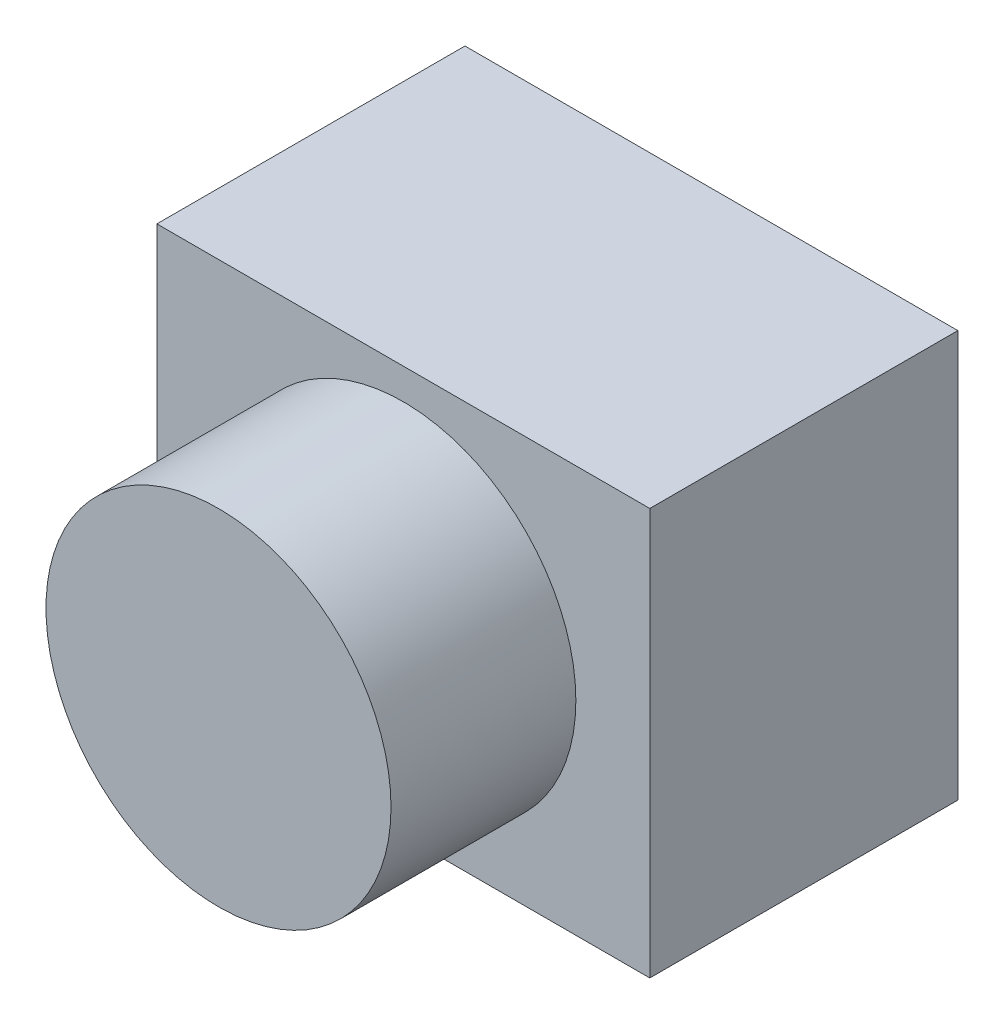
ISO-10303-21;
HEADER;
FILE_DESCRIPTION(('STEP AP214'),'2;1');
FILE_NAME('part.step','',(''),(''),'','','');
FILE_SCHEMA(('AUTOMOTIVE_DESIGN { 1 0 10303 214 1 1 1 1 }'));
ENDSEC;
DATA;
#1=APPLICATION_CONTEXT('core data for automotive mechanical design processes');
#2=APPLICATION_PROTOCOL_DEFINITION('international standard','automotive_design',2000,#1);
#3=PRODUCT_CONTEXT('',#1,'mechanical');
#4=PRODUCT('Part','Part','',(#3));
#5=PRODUCT_RELATED_PRODUCT_CATEGORY('part','',(#4));
#6=PRODUCT_DEFINITION_FORMATION('','',#4);
#7=PRODUCT_DEFINITION_CONTEXT('part definition',#1,'design');
#8=PRODUCT_DEFINITION('design','',#6,#7);
#9=PRODUCT_DEFINITION_SHAPE('','',#8);
#10=(LENGTH_UNIT() NAMED_UNIT(*) SI_UNIT(.MILLI.,.METRE.));
#11=(NAMED_UNIT(*) PLANE_ANGLE_UNIT() SI_UNIT($,.RADIAN.));
#12=(NAMED_UNIT(*) SI_UNIT($,.STERADIAN.) SOLID_ANGLE_UNIT());
#13=UNCERTAINTY_MEASURE_WITH_UNIT(LENGTH_MEASURE(1.E-05),#10,'distance_accuracy_value','');
#14=(GEOMETRIC_REPRESENTATION_CONTEXT(3) GLOBAL_UNCERTAINTY_ASSIGNED_CONTEXT((#13)) GLOBAL_UNIT_ASSIGNED_CONTEXT((#10,
#11,#12)) REPRESENTATION_CONTEXT('',''));
#15=CARTESIAN_POINT('',(0.,0.,0.));
#16=DIRECTION('',(0.,0.,1.));
#17=DIRECTION('',(1.,0.,0.));
#18=AXIS2_PLACEMENT_3D('',#15,#16,#17);
#19=CARTESIAN_POINT('',(-33.0434782608696,32.9347826086957,50.));
#20=DIRECTION('',(1.,0.,0.));
#21=DIRECTION('',(0.,1.,0.));
#22=AXIS2_PLACEMENT_3D('',#19,#20,#21);
#23=PLANE('',#22);
#24=DIRECTION('',(0.,-1.,0.));
#25=VECTOR('',#24,1.);
#26=CARTESIAN_POINT('',(-33.0434782608696,32.9347826086957,0.));
#27=LINE('',#26,#25);
#28=CARTESIAN_POINT('',(-33.0434782608696,32.9347826086957,0.));
#29=VERTEX_POINT('',#28);
#30=CARTESIAN_POINT('',(-33.0434782608696,-33.0652173913043,0.));
#31=VERTEX_POINT('',#30);
#32=EDGE_CURVE('E114',#29,#31,#27,.T.);
#33=ORIENTED_EDGE('',*,*,#32,.T.);
#34=DIRECTION('',(0.,0.,-1.));
#35=VECTOR('',#34,1.);
#36=CARTESIAN_POINT('',(-33.0434782608696,-33.0652173913043,50.));
#37=LINE('',#36,#35);
#38=CARTESIAN_POINT('',(-33.0434782608696,-33.0652173913043,50.));
#39=VERTEX_POINT('',#38);
#40=EDGE_CURVE('E46',#39,#31,#37,.T.);
#41=ORIENTED_EDGE('',*,*,#40,.F.);
#42=DIRECTION('',(0.,-1.,0.));
#43=VECTOR('',#42,1.);
#44=CARTESIAN_POINT('',(-33.0434782608696,32.9347826086957,50.));
#45=LINE('',#44,#43);
#46=CARTESIAN_POINT('',(-33.0434782608696,32.9347826086957,50.));
#47=VERTEX_POINT('',#46);
#48=EDGE_CURVE('E97',#47,#39,#45,.T.);
#49=ORIENTED_EDGE('',*,*,#48,.F.);
#50=DIRECTION('',(0.,0.,-1.));
#51=VECTOR('',#50,1.);
#52=CARTESIAN_POINT('',(-33.0434782608696,32.9347826086957,50.));
#53=LINE('',#52,#51);
#54=EDGE_CURVE('E110',#47,#29,#53,.T.);
#55=ORIENTED_EDGE('',*,*,#54,.T.);
#56=EDGE_LOOP('',(#33,#41,#49,#55));
#57=FACE_BOUND('',#56,.T.);
#58=ADVANCED_FACE('F43',(#57),#23,.F.);
#59=CARTESIAN_POINT('',(-33.0434782608696,-33.0652173913043,50.));
#60=DIRECTION('',(0.,1.,0.));
#61=DIRECTION('',(0.,0.,1.));
#62=AXIS2_PLACEMENT_3D('',#59,#60,#61);
#63=PLANE('',#62);
#64=DIRECTION('',(1.,0.,0.));
#65=VECTOR('',#64,1.);
#66=CARTESIAN_POINT('',(-33.0434782608696,-33.0652173913043,0.));
#67=LINE('',#66,#65);
#68=CARTESIAN_POINT('',(46.9565217391304,-33.0652173913043,0.));
#69=VERTEX_POINT('',#68);
#70=EDGE_CURVE('E103',#31,#69,#67,.T.);
#71=ORIENTED_EDGE('',*,*,#70,.T.);
#72=DIRECTION('',(0.,0.,-1.));
#73=VECTOR('',#72,1.);
#74=CARTESIAN_POINT('',(46.9565217391304,-33.0652173913043,50.));
#75=LINE('',#74,#73);
#76=CARTESIAN_POINT('',(46.9565217391304,-33.0652173913043,50.));
#77=VERTEX_POINT('',#76);
#78=EDGE_CURVE('E101',#77,#69,#75,.T.);
#79=ORIENTED_EDGE('',*,*,#78,.F.);
#80=DIRECTION('',(1.,0.,0.));
#81=VECTOR('',#80,1.);
#82=CARTESIAN_POINT('',(-33.0434782608696,-33.0652173913043,50.));
#83=LINE('',#82,#81);
#84=EDGE_CURVE('E92',#39,#77,#83,.T.);
#85=ORIENTED_EDGE('',*,*,#84,.F.);
#86=ORIENTED_EDGE('',*,*,#40,.T.);
#87=EDGE_LOOP('',(#71,#79,#85,#86));
#88=FACE_BOUND('',#87,.T.);
#89=ADVANCED_FACE('F102',(#88),#63,.F.);
#90=CARTESIAN_POINT('',(46.9565217391304,32.9347826086957,50.));
#91=DIRECTION('',(-1.,0.,0.));
#92=DIRECTION('',(0.,0.,1.));
#93=AXIS2_PLACEMENT_3D('',#90,#91,#92);
#94=PLANE('',#93);
#95=DIRECTION('',(0.,1.,0.));
#96=VECTOR('',#95,1.);
#97=CARTESIAN_POINT('',(46.9565217391304,32.9347826086957,0.));
#98=LINE('',#97,#96);
#99=CARTESIAN_POINT('',(46.9565217391304,32.9347826086957,0.));
#100=VERTEX_POINT('',#99);
#101=EDGE_CURVE('E78',#69,#100,#98,.T.);
#102=ORIENTED_EDGE('',*,*,#101,.T.);
#103=DIRECTION('',(0.,0.,-1.));
#104=VECTOR('',#103,1.);
#105=CARTESIAN_POINT('',(46.9565217391304,32.9347826086957,50.));
#106=LINE('',#105,#104);
#107=CARTESIAN_POINT('',(46.9565217391304,32.9347826086957,50.));
#108=VERTEX_POINT('',#107);
#109=EDGE_CURVE('E105',#108,#100,#106,.T.);
#110=ORIENTED_EDGE('',*,*,#109,.F.);
#111=DIRECTION('',(0.,1.,0.));
#112=VECTOR('',#111,1.);
#113=CARTESIAN_POINT('',(46.9565217391304,32.9347826086957,50.));
#114=LINE('',#113,#112);
#115=EDGE_CURVE('E95',#77,#108,#114,.T.);
#116=ORIENTED_EDGE('',*,*,#115,.F.);
#117=ORIENTED_EDGE('',*,*,#78,.T.);
#118=EDGE_LOOP('',(#102,#110,#116,#117));
#119=FACE_BOUND('',#118,.T.);
#120=ADVANCED_FACE('F106',(#119),#94,.F.);
#121=CARTESIAN_POINT('',(-33.0434782608696,32.9347826086957,50.));
#122=DIRECTION('',(0.,-1.,0.));
#123=DIRECTION('',(0.,0.,-1.));
#124=AXIS2_PLACEMENT_3D('',#121,#122,#123);
#125=PLANE('',#124);
#126=DIRECTION('',(-1.,0.,0.));
#127=VECTOR('',#126,1.);
#128=CARTESIAN_POINT('',(-33.0434782608696,32.9347826086957,0.));
#129=LINE('',#128,#127);
#130=EDGE_CURVE('E84',#100,#29,#129,.T.);
#131=ORIENTED_EDGE('',*,*,#130,.T.);
#132=ORIENTED_EDGE('',*,*,#54,.F.);
#133=DIRECTION('',(-1.,0.,0.));
#134=VECTOR('',#133,1.);
#135=CARTESIAN_POINT('',(-33.0434782608696,32.9347826086957,50.));
#136=LINE('',#135,#134);
#137=EDGE_CURVE('E61',#108,#47,#136,.T.);
#138=ORIENTED_EDGE('',*,*,#137,.F.);
#139=ORIENTED_EDGE('',*,*,#109,.T.);
#140=EDGE_LOOP('',(#131,#132,#138,#139));
#141=FACE_BOUND('',#140,.T.);
#142=ADVANCED_FACE('F128',(#141),#125,.F.);
#143=CARTESIAN_POINT('',(0.,0.,50.));
#144=DIRECTION('',(0.,0.,1.));
#145=DIRECTION('',(1.,0.,0.));
#146=AXIS2_PLACEMENT_3D('',#143,#144,#145);
#147=PLANE('',#146);
#148=CARTESIAN_POINT('',(6.95652173913043,-0.0652173913043425,50.));
#149=DIRECTION('',(0.,0.,1.));
#150=DIRECTION('',(1.,0.,0.));
#151=AXIS2_PLACEMENT_3D('',#148,#149,#150);
#152=CIRCLE('',#151,28.);
#153=CARTESIAN_POINT('',(34.9565217391304,-0.0652173913043425,50.));
#154=VERTEX_POINT('',#153);
#155=EDGE_CURVE('E11',#154,#154,#152,.T.);
#156=ORIENTED_EDGE('',*,*,#155,.F.);
#157=EDGE_LOOP('',(#156));
#158=FACE_BOUND('',#157,.T.);
#159=ORIENTED_EDGE('',*,*,#48,.T.);
#160=ORIENTED_EDGE('',*,*,#84,.T.);
#161=ORIENTED_EDGE('',*,*,#115,.T.);
#162=ORIENTED_EDGE('',*,*,#137,.T.);
#163=EDGE_LOOP('',(#159,#160,#161,#162));
#164=FACE_BOUND('',#163,.T.);
#165=ADVANCED_FACE('F93',(#158,#164),#147,.T.);
#166=CARTESIAN_POINT('',(0.,0.,0.));
#167=DIRECTION('',(0.,0.,1.));
#168=DIRECTION('',(1.,0.,0.));
#169=AXIS2_PLACEMENT_3D('',#166,#167,#168);
#170=PLANE('',#169);
#171=ORIENTED_EDGE('',*,*,#32,.F.);
#172=ORIENTED_EDGE('',*,*,#130,.F.);
#173=ORIENTED_EDGE('',*,*,#101,.F.);
#174=ORIENTED_EDGE('',*,*,#70,.F.);
#175=EDGE_LOOP('',(#171,#172,#173,#174));
#176=FACE_BOUND('',#175,.T.);
#177=ADVANCED_FACE('F131',(#176),#170,.F.);
#178=CARTESIAN_POINT('',(6.95652173913043,-0.0652173913043425,80.));
#179=DIRECTION('',(0.,0.,-1.));
#180=DIRECTION('',(-1.,0.,0.));
#181=AXIS2_PLACEMENT_3D('',#178,#179,#180);
#182=CYLINDRICAL_SURFACE('',#181,28.);
#183=CARTESIAN_POINT('',(6.95652173913043,-0.0652173913043425,80.));
#184=DIRECTION('',(0.,0.,1.));
#185=DIRECTION('',(1.,0.,0.));
#186=AXIS2_PLACEMENT_3D('',#183,#184,#185);
#187=CIRCLE('',#186,28.);
#188=CARTESIAN_POINT('',(34.9565217391304,-0.0652173913043425,80.));
#189=VERTEX_POINT('',#188);
#190=EDGE_CURVE('E118',#189,#189,#187,.T.);
#191=ORIENTED_EDGE('',*,*,#190,.F.);
#192=EDGE_LOOP('',(#191));
#193=FACE_BOUND('',#192,.T.);
#194=ORIENTED_EDGE('',*,*,#155,.T.);
#195=EDGE_LOOP('',(#194));
#196=FACE_BOUND('',#195,.T.);
#197=ADVANCED_FACE('F141',(#193,#196),#182,.T.);
#198=CARTESIAN_POINT('',(6.95652173913043,-0.0652173913043425,80.));
#199=DIRECTION('',(0.,0.,1.));
#200=DIRECTION('',(1.,0.,0.));
#201=AXIS2_PLACEMENT_3D('',#198,#199,#200);
#202=PLANE('',#201);
#203=ORIENTED_EDGE('',*,*,#190,.T.);
#204=EDGE_LOOP('',(#203));
#205=FACE_BOUND('',#204,.T.);
#206=ADVANCED_FACE('F139',(#205),#202,.T.);
#207=CLOSED_SHELL('',(#58,#89,#120,#142,#165,#177,#197,#206));
#208=MANIFOLD_SOLID_BREP('B2',#207);
#209=ADVANCED_BREP_SHAPE_REPRESENTATION('',(#18,#208),#14);
#210=SHAPE_DEFINITION_REPRESENTATION(#9,#209);
ENDSEC;
END-ISO-10303-21;
